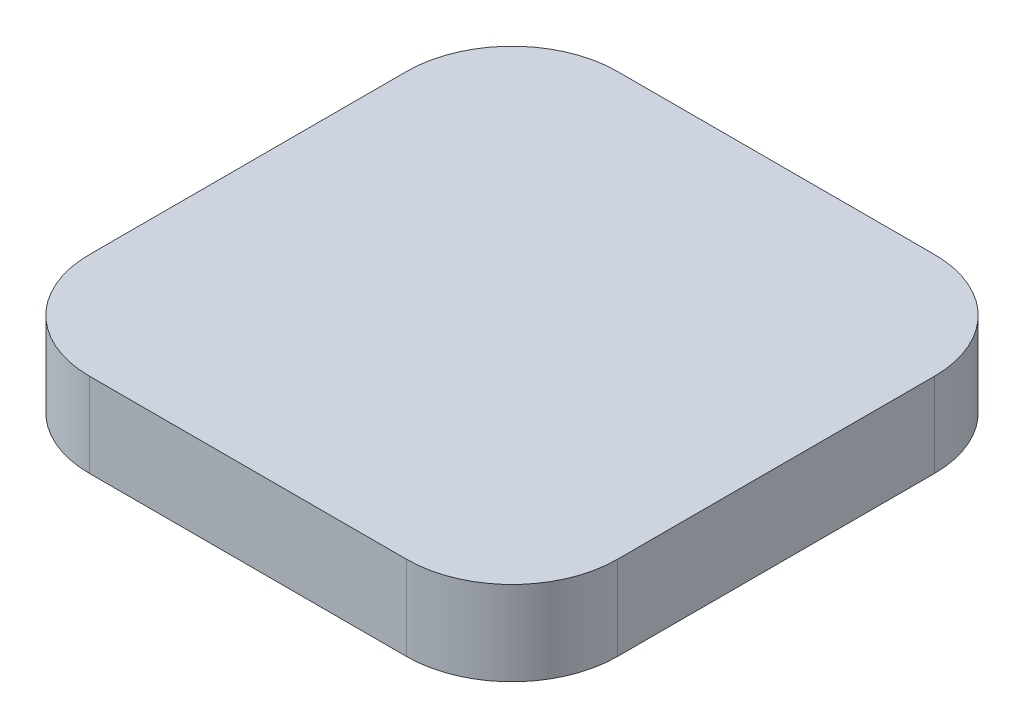
ISO-10303-21;
HEADER;
FILE_DESCRIPTION(('STEP AP214'),'2;1');
FILE_NAME('part.step','',(''),(''),'','','');
FILE_SCHEMA(('AUTOMOTIVE_DESIGN { 1 0 10303 214 1 1 1 1 }'));
ENDSEC;
DATA;
#1=APPLICATION_CONTEXT('core data for automotive mechanical design processes');
#2=APPLICATION_PROTOCOL_DEFINITION('international standard','automotive_design',2000,#1);
#3=PRODUCT_CONTEXT('',#1,'mechanical');
#4=PRODUCT('Part','Part','',(#3));
#5=PRODUCT_RELATED_PRODUCT_CATEGORY('part','',(#4));
#6=PRODUCT_DEFINITION_FORMATION('','',#4);
#7=PRODUCT_DEFINITION_CONTEXT('part definition',#1,'design');
#8=PRODUCT_DEFINITION('design','',#6,#7);
#9=PRODUCT_DEFINITION_SHAPE('','',#8);
#10=(LENGTH_UNIT() NAMED_UNIT(*) SI_UNIT(.MILLI.,.METRE.));
#11=(NAMED_UNIT(*) PLANE_ANGLE_UNIT() SI_UNIT($,.RADIAN.));
#12=(NAMED_UNIT(*) SI_UNIT($,.STERADIAN.) SOLID_ANGLE_UNIT());
#13=UNCERTAINTY_MEASURE_WITH_UNIT(LENGTH_MEASURE(1.E-05),#10,'distance_accuracy_value','');
#14=(GEOMETRIC_REPRESENTATION_CONTEXT(3) GLOBAL_UNCERTAINTY_ASSIGNED_CONTEXT((#13)) GLOBAL_UNIT_ASSIGNED_CONTEXT((#10,
#11,#12)) REPRESENTATION_CONTEXT('',''));
#15=CARTESIAN_POINT('',(0.,0.,0.));
#16=DIRECTION('',(0.,0.,1.));
#17=DIRECTION('',(1.,0.,0.));
#18=AXIS2_PLACEMENT_3D('',#15,#16,#17);
#19=CARTESIAN_POINT('',(-40.000000000015,7.2938,-34.493654));
#20=DIRECTION('',(0.,1.,0.));
#21=DIRECTION('',(0.,0.,1.));
#22=AXIS2_PLACEMENT_3D('',#19,#20,#21);
#23=PLANE('',#22);
#24=DIRECTION('',(-1.,0.,0.));
#25=VECTOR('',#24,1.);
#26=CARTESIAN_POINT('',(-40.000000000015,7.2938,-37.000254));
#27=LINE('',#26,#25);
#28=CARTESIAN_POINT('',(-36.486800000015,7.2938,-37.000254));
#29=VERTEX_POINT('',#28);
#30=CARTESIAN_POINT('',(-39.500000000015,7.2938,-37.000254));
#31=VERTEX_POINT('',#30);
#32=EDGE_CURVE('E83',#29,#31,#27,.T.);
#33=ORIENTED_EDGE('',*,*,#32,.F.);
#34=CARTESIAN_POINT('',(-36.486800000015,7.2938,-36.000254));
#35=DIRECTION('',(0.,-1.,0.));
#36=DIRECTION('',(0.,0.,-1.));
#37=AXIS2_PLACEMENT_3D('',#34,#35,#36);
#38=CIRCLE('',#37,1.);
#39=CARTESIAN_POINT('',(-35.486800000015,7.2938,-36.000254));
#40=VERTEX_POINT('',#39);
#41=EDGE_CURVE('E95',#40,#29,#38,.F.);
#42=ORIENTED_EDGE('',*,*,#41,.F.);
#43=DIRECTION('',(0.,0.,-1.));
#44=VECTOR('',#43,1.);
#45=CARTESIAN_POINT('',(-35.486800000015,7.2938,-36.500254));
#46=LINE('',#45,#44);
#47=CARTESIAN_POINT('',(-35.486800000015,7.2938,-32.987054));
#48=VERTEX_POINT('',#47);
#49=EDGE_CURVE('E105',#48,#40,#46,.T.);
#50=ORIENTED_EDGE('',*,*,#49,.F.);
#51=CARTESIAN_POINT('',(-36.486800000015,7.2938,-32.987054));
#52=DIRECTION('',(0.,-1.,0.));
#53=DIRECTION('',(0.,0.,-1.));
#54=AXIS2_PLACEMENT_3D('',#51,#52,#53);
#55=CIRCLE('',#54,1.);
#56=CARTESIAN_POINT('',(-36.486800000015,7.2938,-31.987054));
#57=VERTEX_POINT('',#56);
#58=EDGE_CURVE('E126',#57,#48,#55,.F.);
#59=ORIENTED_EDGE('',*,*,#58,.F.);
#60=DIRECTION('',(1.,0.,0.));
#61=VECTOR('',#60,1.);
#62=CARTESIAN_POINT('',(-35.986800000015,7.2938,-31.987054));
#63=LINE('',#62,#61);
#64=CARTESIAN_POINT('',(-39.500000000015,7.2938,-31.987054));
#65=VERTEX_POINT('',#64);
#66=EDGE_CURVE('E109',#65,#57,#63,.T.);
#67=ORIENTED_EDGE('',*,*,#66,.F.);
#68=CARTESIAN_POINT('',(-39.500000000015,7.2938,-32.987054));
#69=DIRECTION('',(0.,-1.,0.));
#70=DIRECTION('',(0.,0.,-1.));
#71=AXIS2_PLACEMENT_3D('',#68,#69,#70);
#72=CIRCLE('',#71,1.);
#73=CARTESIAN_POINT('',(-40.500000000015,7.2938,-32.987054));
#74=VERTEX_POINT('',#73);
#75=EDGE_CURVE('E127',#74,#65,#72,.F.);
#76=ORIENTED_EDGE('',*,*,#75,.F.);
#77=DIRECTION('',(0.,0.,1.));
#78=VECTOR('',#77,1.);
#79=CARTESIAN_POINT('',(-40.500000000015,7.2938,-32.487054));
#80=LINE('',#79,#78);
#81=CARTESIAN_POINT('',(-40.500000000015,7.2938,-36.000254));
#82=VERTEX_POINT('',#81);
#83=EDGE_CURVE('E85',#82,#74,#80,.T.);
#84=ORIENTED_EDGE('',*,*,#83,.F.);
#85=CARTESIAN_POINT('',(-39.500000000015,7.2938,-36.000254));
#86=DIRECTION('',(0.,-1.,0.));
#87=DIRECTION('',(0.,0.,-1.));
#88=AXIS2_PLACEMENT_3D('',#85,#86,#87);
#89=CIRCLE('',#88,1.);
#90=EDGE_CURVE('E20',#31,#82,#89,.F.);
#91=ORIENTED_EDGE('',*,*,#90,.F.);
#92=EDGE_LOOP('',(#33,#42,#50,#59,#67,#76,#84,#91));
#93=FACE_BOUND('',#92,.T.);
#94=ADVANCED_FACE('F17',(#93),#23,.F.);
#95=CARTESIAN_POINT('',(-39.500000000015,8.0938,-36.000254));
#96=DIRECTION('',(0.,-1.,0.));
#97=DIRECTION('',(0.,0.,-1.));
#98=AXIS2_PLACEMENT_3D('',#95,#96,#97);
#99=CYLINDRICAL_SURFACE('',#98,1.);
#100=DIRECTION('',(0.,1.,0.));
#101=VECTOR('',#100,1.);
#102=CARTESIAN_POINT('',(-40.500000000015,8.0938,-36.000254));
#103=LINE('',#102,#101);
#104=CARTESIAN_POINT('',(-40.500000000015,8.0938,-36.000254));
#105=VERTEX_POINT('',#104);
#106=EDGE_CURVE('E88',#105,#82,#103,.F.);
#107=ORIENTED_EDGE('',*,*,#106,.F.);
#108=CARTESIAN_POINT('',(-39.500000000015,8.0938,-36.000254));
#109=DIRECTION('',(0.,-1.,0.));
#110=DIRECTION('',(0.,0.,-1.));
#111=AXIS2_PLACEMENT_3D('',#108,#109,#110);
#112=CIRCLE('',#111,1.);
#113=CARTESIAN_POINT('',(-39.500000000015,8.0938,-37.000254));
#114=VERTEX_POINT('',#113);
#115=EDGE_CURVE('E93',#114,#105,#112,.F.);
#116=ORIENTED_EDGE('',*,*,#115,.F.);
#117=DIRECTION('',(0.,1.,0.));
#118=VECTOR('',#117,1.);
#119=CARTESIAN_POINT('',(-39.500000000015,8.0938,-37.000254));
#120=LINE('',#119,#118);
#121=EDGE_CURVE('E90',#31,#114,#120,.T.);
#122=ORIENTED_EDGE('',*,*,#121,.F.);
#123=ORIENTED_EDGE('',*,*,#90,.T.);
#124=EDGE_LOOP('',(#107,#116,#122,#123));
#125=FACE_BOUND('',#124,.T.);
#126=ADVANCED_FACE('F91',(#125),#99,.T.);
#127=CARTESIAN_POINT('',(-40.500000000015,8.0938,-32.487054));
#128=DIRECTION('',(-1.,0.,0.));
#129=DIRECTION('',(0.,0.,1.));
#130=AXIS2_PLACEMENT_3D('',#127,#128,#129);
#131=PLANE('',#130);
#132=DIRECTION('',(0.,-1.,0.));
#133=VECTOR('',#132,1.);
#134=CARTESIAN_POINT('',(-40.500000000015,8.0938,-32.987054));
#135=LINE('',#134,#133);
#136=CARTESIAN_POINT('',(-40.500000000015,8.0938,-32.987054));
#137=VERTEX_POINT('',#136);
#138=EDGE_CURVE('E114',#137,#74,#135,.T.);
#139=ORIENTED_EDGE('',*,*,#138,.F.);
#140=DIRECTION('',(0.,0.,1.));
#141=VECTOR('',#140,1.);
#142=CARTESIAN_POINT('',(-40.500000000015,8.0938,-34.493654));
#143=LINE('',#142,#141);
#144=EDGE_CURVE('E99',#105,#137,#143,.T.);
#145=ORIENTED_EDGE('',*,*,#144,.F.);
#146=ORIENTED_EDGE('',*,*,#106,.T.);
#147=ORIENTED_EDGE('',*,*,#83,.T.);
#148=EDGE_LOOP('',(#139,#145,#146,#147));
#149=FACE_BOUND('',#148,.T.);
#150=ADVANCED_FACE('F205',(#149),#131,.T.);
#151=CARTESIAN_POINT('',(-39.500000000015,8.0938,-32.987054));
#152=DIRECTION('',(0.,-1.,0.));
#153=DIRECTION('',(0.,0.,-1.));
#154=AXIS2_PLACEMENT_3D('',#151,#152,#153);
#155=CYLINDRICAL_SURFACE('',#154,1.);
#156=DIRECTION('',(0.,1.,0.));
#157=VECTOR('',#156,1.);
#158=CARTESIAN_POINT('',(-39.500000000015,8.0938,-31.987054));
#159=LINE('',#158,#157);
#160=CARTESIAN_POINT('',(-39.500000000015,8.0938,-31.987054));
#161=VERTEX_POINT('',#160);
#162=EDGE_CURVE('E112',#161,#65,#159,.F.);
#163=ORIENTED_EDGE('',*,*,#162,.F.);
#164=CARTESIAN_POINT('',(-39.500000000015,8.0938,-32.987054));
#165=DIRECTION('',(0.,-1.,0.));
#166=DIRECTION('',(0.,0.,-1.));
#167=AXIS2_PLACEMENT_3D('',#164,#165,#166);
#168=CIRCLE('',#167,1.);
#169=EDGE_CURVE('E122',#137,#161,#168,.F.);
#170=ORIENTED_EDGE('',*,*,#169,.F.);
#171=ORIENTED_EDGE('',*,*,#138,.T.);
#172=ORIENTED_EDGE('',*,*,#75,.T.);
#173=EDGE_LOOP('',(#163,#170,#171,#172));
#174=FACE_BOUND('',#173,.T.);
#175=ADVANCED_FACE('F197',(#174),#155,.T.);
#176=CARTESIAN_POINT('',(-35.986800000015,8.0938,-31.987054));
#177=DIRECTION('',(0.,0.,1.));
#178=DIRECTION('',(1.,0.,0.));
#179=AXIS2_PLACEMENT_3D('',#176,#177,#178);
#180=PLANE('',#179);
#181=DIRECTION('',(0.,-1.,0.));
#182=VECTOR('',#181,1.);
#183=CARTESIAN_POINT('',(-36.486800000015,8.0938,-31.987054));
#184=LINE('',#183,#182);
#185=CARTESIAN_POINT('',(-36.486800000015,8.0938,-31.987054));
#186=VERTEX_POINT('',#185);
#187=EDGE_CURVE('E111',#186,#57,#184,.T.);
#188=ORIENTED_EDGE('',*,*,#187,.F.);
#189=DIRECTION('',(1.,0.,0.));
#190=VECTOR('',#189,1.);
#191=CARTESIAN_POINT('',(-40.000000000015,8.0938,-31.987054));
#192=LINE('',#191,#190);
#193=EDGE_CURVE('E121',#161,#186,#192,.T.);
#194=ORIENTED_EDGE('',*,*,#193,.F.);
#195=ORIENTED_EDGE('',*,*,#162,.T.);
#196=ORIENTED_EDGE('',*,*,#66,.T.);
#197=EDGE_LOOP('',(#188,#194,#195,#196));
#198=FACE_BOUND('',#197,.T.);
#199=ADVANCED_FACE('F189',(#198),#180,.T.);
#200=CARTESIAN_POINT('',(-36.486800000015,8.0938,-32.987054));
#201=DIRECTION('',(0.,-1.,0.));
#202=DIRECTION('',(0.,0.,-1.));
#203=AXIS2_PLACEMENT_3D('',#200,#201,#202);
#204=CYLINDRICAL_SURFACE('',#203,1.);
#205=DIRECTION('',(0.,1.,0.));
#206=VECTOR('',#205,1.);
#207=CARTESIAN_POINT('',(-35.486800000015,8.0938,-32.987054));
#208=LINE('',#207,#206);
#209=CARTESIAN_POINT('',(-35.486800000015,8.0938,-32.987054));
#210=VERTEX_POINT('',#209);
#211=EDGE_CURVE('E108',#210,#48,#208,.F.);
#212=ORIENTED_EDGE('',*,*,#211,.F.);
#213=CARTESIAN_POINT('',(-36.486800000015,8.0938,-32.987054));
#214=DIRECTION('',(0.,-1.,0.));
#215=DIRECTION('',(0.,0.,-1.));
#216=AXIS2_PLACEMENT_3D('',#213,#214,#215);
#217=CIRCLE('',#216,1.);
#218=EDGE_CURVE('E118',#186,#210,#217,.F.);
#219=ORIENTED_EDGE('',*,*,#218,.F.);
#220=ORIENTED_EDGE('',*,*,#187,.T.);
#221=ORIENTED_EDGE('',*,*,#58,.T.);
#222=EDGE_LOOP('',(#212,#219,#220,#221));
#223=FACE_BOUND('',#222,.T.);
#224=ADVANCED_FACE('F162',(#223),#204,.T.);
#225=CARTESIAN_POINT('',(-35.486800000015,8.0938,-36.500254));
#226=DIRECTION('',(1.,0.,0.));
#227=DIRECTION('',(0.,0.,-1.));
#228=AXIS2_PLACEMENT_3D('',#225,#226,#227);
#229=PLANE('',#228);
#230=ORIENTED_EDGE('',*,*,#211,.T.);
#231=ORIENTED_EDGE('',*,*,#49,.T.);
#232=DIRECTION('',(0.,-1.,0.));
#233=VECTOR('',#232,1.);
#234=CARTESIAN_POINT('',(-35.486800000015,8.0938,-36.000254));
#235=LINE('',#234,#233);
#236=CARTESIAN_POINT('',(-35.486800000015,8.0938,-36.000254));
#237=VERTEX_POINT('',#236);
#238=EDGE_CURVE('E107',#237,#40,#235,.T.);
#239=ORIENTED_EDGE('',*,*,#238,.F.);
#240=DIRECTION('',(0.,0.,1.));
#241=VECTOR('',#240,1.);
#242=CARTESIAN_POINT('',(-35.486800000015,8.0938,-34.493654));
#243=LINE('',#242,#241);
#244=EDGE_CURVE('E117',#210,#237,#243,.F.);
#245=ORIENTED_EDGE('',*,*,#244,.F.);
#246=EDGE_LOOP('',(#230,#231,#239,#245));
#247=FACE_BOUND('',#246,.T.);
#248=ADVANCED_FACE('F151',(#247),#229,.T.);
#249=CARTESIAN_POINT('',(-36.486800000015,8.0938,-36.000254));
#250=DIRECTION('',(0.,-1.,0.));
#251=DIRECTION('',(0.,0.,-1.));
#252=AXIS2_PLACEMENT_3D('',#249,#250,#251);
#253=CYLINDRICAL_SURFACE('',#252,1.);
#254=DIRECTION('',(0.,1.,0.));
#255=VECTOR('',#254,1.);
#256=CARTESIAN_POINT('',(-36.486800000015,8.0938,-37.000254));
#257=LINE('',#256,#255);
#258=CARTESIAN_POINT('',(-36.486800000015,8.0938,-37.000254));
#259=VERTEX_POINT('',#258);
#260=EDGE_CURVE('E35',#259,#29,#257,.F.);
#261=ORIENTED_EDGE('',*,*,#260,.F.);
#262=CARTESIAN_POINT('',(-36.486800000015,8.0938,-36.000254));
#263=DIRECTION('',(0.,-1.,0.));
#264=DIRECTION('',(0.,0.,-1.));
#265=AXIS2_PLACEMENT_3D('',#262,#263,#264);
#266=CIRCLE('',#265,1.);
#267=EDGE_CURVE('E26',#237,#259,#266,.F.);
#268=ORIENTED_EDGE('',*,*,#267,.F.);
#269=ORIENTED_EDGE('',*,*,#238,.T.);
#270=ORIENTED_EDGE('',*,*,#41,.T.);
#271=EDGE_LOOP('',(#261,#268,#269,#270));
#272=FACE_BOUND('',#271,.T.);
#273=ADVANCED_FACE('F153',(#272),#253,.T.);
#274=CARTESIAN_POINT('',(-40.000000000015,8.0938,-37.000254));
#275=DIRECTION('',(0.,0.,-1.));
#276=DIRECTION('',(-1.,0.,0.));
#277=AXIS2_PLACEMENT_3D('',#274,#275,#276);
#278=PLANE('',#277);
#279=ORIENTED_EDGE('',*,*,#260,.T.);
#280=ORIENTED_EDGE('',*,*,#32,.T.);
#281=ORIENTED_EDGE('',*,*,#121,.T.);
#282=DIRECTION('',(1.,0.,0.));
#283=VECTOR('',#282,1.);
#284=CARTESIAN_POINT('',(-40.000000000015,8.0938,-37.000254));
#285=LINE('',#284,#283);
#286=EDGE_CURVE('E11',#259,#114,#285,.F.);
#287=ORIENTED_EDGE('',*,*,#286,.F.);
#288=EDGE_LOOP('',(#279,#280,#281,#287));
#289=FACE_BOUND('',#288,.T.);
#290=ADVANCED_FACE('F97',(#289),#278,.T.);
#291=CARTESIAN_POINT('',(-40.000000000015,8.0938,-34.493654));
#292=DIRECTION('',(0.,1.,0.));
#293=DIRECTION('',(0.,0.,1.));
#294=AXIS2_PLACEMENT_3D('',#291,#292,#293);
#295=PLANE('',#294);
#296=ORIENTED_EDGE('',*,*,#267,.T.);
#297=ORIENTED_EDGE('',*,*,#286,.T.);
#298=ORIENTED_EDGE('',*,*,#115,.T.);
#299=ORIENTED_EDGE('',*,*,#144,.T.);
#300=ORIENTED_EDGE('',*,*,#169,.T.);
#301=ORIENTED_EDGE('',*,*,#193,.T.);
#302=ORIENTED_EDGE('',*,*,#218,.T.);
#303=ORIENTED_EDGE('',*,*,#244,.T.);
#304=EDGE_LOOP('',(#296,#297,#298,#299,#300,#301,#302,#303));
#305=FACE_BOUND('',#304,.T.);
#306=ADVANCED_FACE('F148',(#305),#295,.T.);
#307=CLOSED_SHELL('',(#94,#126,#150,#175,#199,#224,#248,#273,#290,#306));
#308=MANIFOLD_SOLID_BREP('B1',#307);
#309=ADVANCED_BREP_SHAPE_REPRESENTATION('',(#18,#308),#14);
#310=SHAPE_DEFINITION_REPRESENTATION(#9,#309);
ENDSEC;
END-ISO-10303-21;
